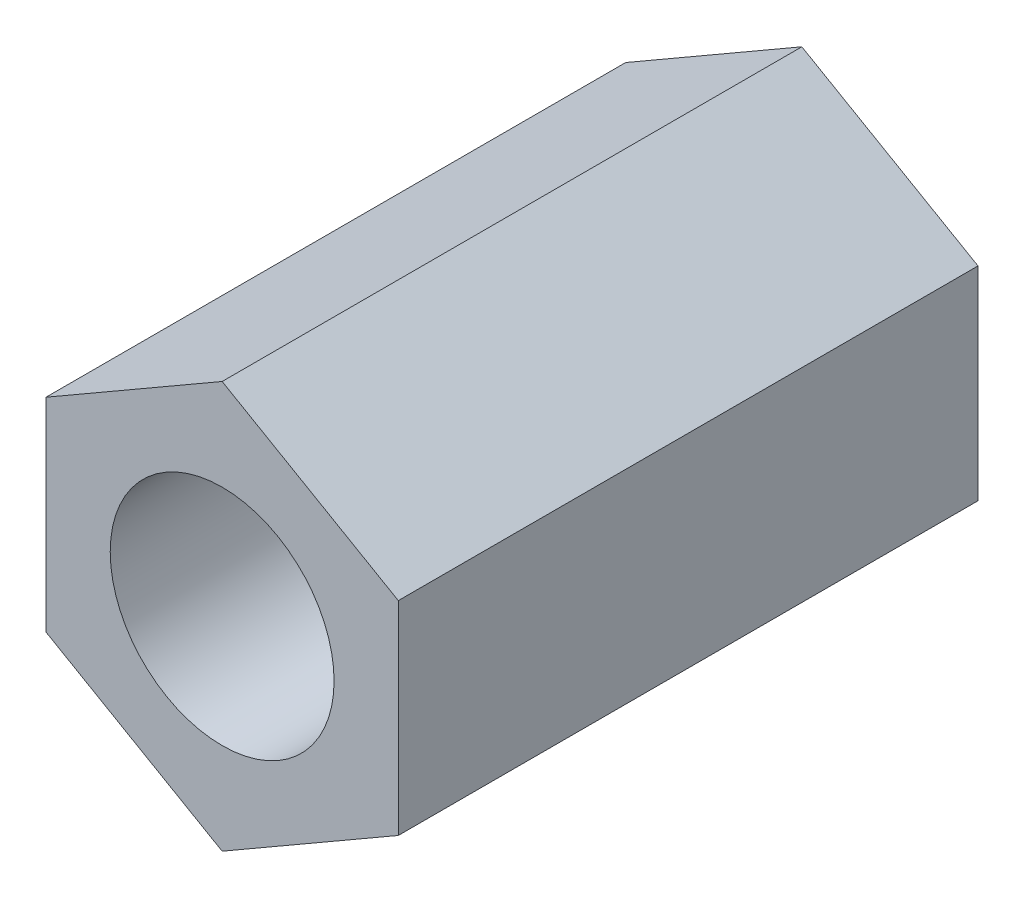
ISO-10303-21;
HEADER;
FILE_DESCRIPTION(('STEP AP214'),'2;1');
FILE_NAME('part.step','',(''),(''),'','','');
FILE_SCHEMA(('AUTOMOTIVE_DESIGN { 1 0 10303 214 1 1 1 1 }'));
ENDSEC;
DATA;
#1=APPLICATION_CONTEXT('core data for automotive mechanical design processes');
#2=APPLICATION_PROTOCOL_DEFINITION('international standard','automotive_design',2000,#1);
#3=PRODUCT_CONTEXT('',#1,'mechanical');
#4=PRODUCT('Part','Part','',(#3));
#5=PRODUCT_RELATED_PRODUCT_CATEGORY('part','',(#4));
#6=PRODUCT_DEFINITION_FORMATION('','',#4);
#7=PRODUCT_DEFINITION_CONTEXT('part definition',#1,'design');
#8=PRODUCT_DEFINITION('design','',#6,#7);
#9=PRODUCT_DEFINITION_SHAPE('','',#8);
#10=(LENGTH_UNIT() NAMED_UNIT(*) SI_UNIT(.MILLI.,.METRE.));
#11=(NAMED_UNIT(*) PLANE_ANGLE_UNIT() SI_UNIT($,.RADIAN.));
#12=(NAMED_UNIT(*) SI_UNIT($,.STERADIAN.) SOLID_ANGLE_UNIT());
#13=UNCERTAINTY_MEASURE_WITH_UNIT(LENGTH_MEASURE(1.E-05),#10,'distance_accuracy_value','');
#14=(GEOMETRIC_REPRESENTATION_CONTEXT(3) GLOBAL_UNCERTAINTY_ASSIGNED_CONTEXT((#13)) GLOBAL_UNIT_ASSIGNED_CONTEXT((#10,
#11,#12)) REPRESENTATION_CONTEXT('',''));
#15=CARTESIAN_POINT('',(0.,0.,0.));
#16=DIRECTION('',(0.,0.,1.));
#17=DIRECTION('',(1.,0.,0.));
#18=AXIS2_PLACEMENT_3D('',#15,#16,#17);
#19=CARTESIAN_POINT('',(2.75,1.58771324027147,10.));
#20=DIRECTION('',(-0.5,-0.866025403784439,0.));
#21=DIRECTION('',(0.866025403784439,-0.5,0.));
#22=AXIS2_PLACEMENT_3D('',#19,#20,#21);
#23=PLANE('',#22);
#24=DIRECTION('',(0.866025403784439,-0.5,0.));
#25=VECTOR('',#24,1.);
#26=CARTESIAN_POINT('',(2.75,1.58771324027147,0.95));
#27=LINE('',#26,#25);
#28=CARTESIAN_POINT('',(0.,3.17542648054295,0.95));
#29=VERTEX_POINT('',#28);
#30=CARTESIAN_POINT('',(2.75,1.58771324027147,0.95));
#31=VERTEX_POINT('',#30);
#32=EDGE_CURVE('E32',#29,#31,#27,.T.);
#33=ORIENTED_EDGE('',*,*,#32,.F.);
#34=DIRECTION('',(0.,0.,-1.));
#35=VECTOR('',#34,1.);
#36=CARTESIAN_POINT('',(0.,3.17542648054295,10.));
#37=LINE('',#36,#35);
#38=CARTESIAN_POINT('',(0.,3.17542648054295,10.));
#39=VERTEX_POINT('',#38);
#40=EDGE_CURVE('E11',#39,#29,#37,.T.);
#41=ORIENTED_EDGE('',*,*,#40,.F.);
#42=DIRECTION('',(-0.866025403784439,0.5,0.));
#43=VECTOR('',#42,1.);
#44=CARTESIAN_POINT('',(2.75,1.58771324027147,10.));
#45=LINE('',#44,#43);
#46=CARTESIAN_POINT('',(2.75,1.58771324027147,10.));
#47=VERTEX_POINT('',#46);
#48=EDGE_CURVE('E120',#47,#39,#45,.T.);
#49=ORIENTED_EDGE('',*,*,#48,.F.);
#50=DIRECTION('',(0.,0.,-1.));
#51=VECTOR('',#50,1.);
#52=CARTESIAN_POINT('',(2.75,1.58771324027147,10.));
#53=LINE('',#52,#51);
#54=EDGE_CURVE('E88',#47,#31,#53,.T.);
#55=ORIENTED_EDGE('',*,*,#54,.T.);
#56=EDGE_LOOP('',(#33,#41,#49,#55));
#57=FACE_BOUND('',#56,.T.);
#58=ADVANCED_FACE('F17',(#57),#23,.F.);
#59=CARTESIAN_POINT('',(0.,3.17542648054295,10.));
#60=DIRECTION('',(0.5,-0.866025403784439,0.));
#61=DIRECTION('',(0.866025403784439,0.5,0.));
#62=AXIS2_PLACEMENT_3D('',#59,#60,#61);
#63=PLANE('',#62);
#64=DIRECTION('',(0.866025403784439,0.5,0.));
#65=VECTOR('',#64,1.);
#66=CARTESIAN_POINT('',(0.,3.17542648054295,0.95));
#67=LINE('',#66,#65);
#68=CARTESIAN_POINT('',(-2.75,1.58771324027147,0.95));
#69=VERTEX_POINT('',#68);
#70=EDGE_CURVE('E110',#69,#29,#67,.T.);
#71=ORIENTED_EDGE('',*,*,#70,.F.);
#72=DIRECTION('',(0.,0.,-1.));
#73=VECTOR('',#72,1.);
#74=CARTESIAN_POINT('',(-2.75,1.58771324027147,10.));
#75=LINE('',#74,#73);
#76=CARTESIAN_POINT('',(-2.75,1.58771324027147,10.));
#77=VERTEX_POINT('',#76);
#78=EDGE_CURVE('E25',#77,#69,#75,.T.);
#79=ORIENTED_EDGE('',*,*,#78,.F.);
#80=DIRECTION('',(-0.866025403784439,-0.5,0.));
#81=VECTOR('',#80,1.);
#82=CARTESIAN_POINT('',(0.,3.17542648054295,10.));
#83=LINE('',#82,#81);
#84=EDGE_CURVE('E109',#39,#77,#83,.T.);
#85=ORIENTED_EDGE('',*,*,#84,.F.);
#86=ORIENTED_EDGE('',*,*,#40,.T.);
#87=EDGE_LOOP('',(#71,#79,#85,#86));
#88=FACE_BOUND('',#87,.T.);
#89=ADVANCED_FACE('F108',(#88),#63,.F.);
#90=CARTESIAN_POINT('',(-2.75,1.58771324027147,10.));
#91=DIRECTION('',(1.,0.,0.));
#92=DIRECTION('',(0.,1.,0.));
#93=AXIS2_PLACEMENT_3D('',#90,#91,#92);
#94=PLANE('',#93);
#95=DIRECTION('',(0.,1.,0.));
#96=VECTOR('',#95,1.);
#97=CARTESIAN_POINT('',(-2.75,1.58771324027147,0.95));
#98=LINE('',#97,#96);
#99=CARTESIAN_POINT('',(-2.75,-1.58771324027147,0.95));
#100=VERTEX_POINT('',#99);
#101=EDGE_CURVE('E104',#100,#69,#98,.T.);
#102=ORIENTED_EDGE('',*,*,#101,.F.);
#103=DIRECTION('',(0.,0.,-1.));
#104=VECTOR('',#103,1.);
#105=CARTESIAN_POINT('',(-2.75,-1.58771324027147,10.));
#106=LINE('',#105,#104);
#107=CARTESIAN_POINT('',(-2.75,-1.58771324027147,10.));
#108=VERTEX_POINT('',#107);
#109=EDGE_CURVE('E90',#108,#100,#106,.T.);
#110=ORIENTED_EDGE('',*,*,#109,.F.);
#111=DIRECTION('',(0.,-1.,0.));
#112=VECTOR('',#111,1.);
#113=CARTESIAN_POINT('',(-2.75,1.58771324027147,10.));
#114=LINE('',#113,#112);
#115=EDGE_CURVE('E105',#77,#108,#114,.T.);
#116=ORIENTED_EDGE('',*,*,#115,.F.);
#117=ORIENTED_EDGE('',*,*,#78,.T.);
#118=EDGE_LOOP('',(#102,#110,#116,#117));
#119=FACE_BOUND('',#118,.T.);
#120=ADVANCED_FACE('F102',(#119),#94,.F.);
#121=CARTESIAN_POINT('',(-2.75,-1.58771324027147,10.));
#122=DIRECTION('',(0.5,0.866025403784439,0.));
#123=DIRECTION('',(-0.866025403784439,0.5,0.));
#124=AXIS2_PLACEMENT_3D('',#121,#122,#123);
#125=PLANE('',#124);
#126=DIRECTION('',(-0.866025403784439,0.5,0.));
#127=VECTOR('',#126,1.);
#128=CARTESIAN_POINT('',(-2.75,-1.58771324027147,0.95));
#129=LINE('',#128,#127);
#130=CARTESIAN_POINT('',(0.,-3.17542648054294,0.95));
#131=VERTEX_POINT('',#130);
#132=EDGE_CURVE('E85',#131,#100,#129,.T.);
#133=ORIENTED_EDGE('',*,*,#132,.F.);
#134=DIRECTION('',(0.,0.,-1.));
#135=VECTOR('',#134,1.);
#136=CARTESIAN_POINT('',(0.,-3.17542648054294,10.));
#137=LINE('',#136,#135);
#138=CARTESIAN_POINT('',(0.,-3.17542648054294,10.));
#139=VERTEX_POINT('',#138);
#140=EDGE_CURVE('E84',#139,#131,#137,.T.);
#141=ORIENTED_EDGE('',*,*,#140,.F.);
#142=DIRECTION('',(0.866025403784439,-0.5,0.));
#143=VECTOR('',#142,1.);
#144=CARTESIAN_POINT('',(-2.75,-1.58771324027147,10.));
#145=LINE('',#144,#143);
#146=EDGE_CURVE('E124',#108,#139,#145,.T.);
#147=ORIENTED_EDGE('',*,*,#146,.F.);
#148=ORIENTED_EDGE('',*,*,#109,.T.);
#149=EDGE_LOOP('',(#133,#141,#147,#148));
#150=FACE_BOUND('',#149,.T.);
#151=ADVANCED_FACE('F131',(#150),#125,.F.);
#152=CARTESIAN_POINT('',(0.,-3.17542648054294,10.));
#153=DIRECTION('',(-0.5,0.866025403784439,0.));
#154=DIRECTION('',(-0.866025403784439,-0.5,0.));
#155=AXIS2_PLACEMENT_3D('',#152,#153,#154);
#156=PLANE('',#155);
#157=DIRECTION('',(-0.866025403784439,-0.5,0.));
#158=VECTOR('',#157,1.);
#159=CARTESIAN_POINT('',(0.,-3.17542648054294,0.95));
#160=LINE('',#159,#158);
#161=CARTESIAN_POINT('',(2.75,-1.58771324027147,0.95));
#162=VERTEX_POINT('',#161);
#163=EDGE_CURVE('E71',#162,#131,#160,.T.);
#164=ORIENTED_EDGE('',*,*,#163,.F.);
#165=DIRECTION('',(0.,0.,-1.));
#166=VECTOR('',#165,1.);
#167=CARTESIAN_POINT('',(2.75,-1.58771324027147,10.));
#168=LINE('',#167,#166);
#169=CARTESIAN_POINT('',(2.75,-1.58771324027147,10.));
#170=VERTEX_POINT('',#169);
#171=EDGE_CURVE('E82',#170,#162,#168,.T.);
#172=ORIENTED_EDGE('',*,*,#171,.F.);
#173=DIRECTION('',(0.866025403784439,0.5,0.));
#174=VECTOR('',#173,1.);
#175=CARTESIAN_POINT('',(0.,-3.17542648054294,10.));
#176=LINE('',#175,#174);
#177=EDGE_CURVE('E126',#139,#170,#176,.T.);
#178=ORIENTED_EDGE('',*,*,#177,.F.);
#179=ORIENTED_EDGE('',*,*,#140,.T.);
#180=EDGE_LOOP('',(#164,#172,#178,#179));
#181=FACE_BOUND('',#180,.T.);
#182=ADVANCED_FACE('F80',(#181),#156,.F.);
#183=CARTESIAN_POINT('',(2.75,-1.58771324027147,10.));
#184=DIRECTION('',(-1.,0.,0.));
#185=DIRECTION('',(0.,-1.,0.));
#186=AXIS2_PLACEMENT_3D('',#183,#184,#185);
#187=PLANE('',#186);
#188=DIRECTION('',(0.,-1.,0.));
#189=VECTOR('',#188,1.);
#190=CARTESIAN_POINT('',(2.75,-1.58771324027147,0.95));
#191=LINE('',#190,#189);
#192=EDGE_CURVE('E68',#31,#162,#191,.T.);
#193=ORIENTED_EDGE('',*,*,#192,.F.);
#194=ORIENTED_EDGE('',*,*,#54,.F.);
#195=DIRECTION('',(0.,1.,0.));
#196=VECTOR('',#195,1.);
#197=CARTESIAN_POINT('',(2.75,-1.58771324027147,10.));
#198=LINE('',#197,#196);
#199=EDGE_CURVE('E40',#170,#47,#198,.T.);
#200=ORIENTED_EDGE('',*,*,#199,.F.);
#201=ORIENTED_EDGE('',*,*,#171,.T.);
#202=EDGE_LOOP('',(#193,#194,#200,#201));
#203=FACE_BOUND('',#202,.T.);
#204=ADVANCED_FACE('F87',(#203),#187,.F.);
#205=CARTESIAN_POINT('',(0.,0.,10.));
#206=DIRECTION('',(0.,0.,-1.));
#207=DIRECTION('',(-1.,0.,0.));
#208=AXIS2_PLACEMENT_3D('',#205,#206,#207);
#209=CYLINDRICAL_SURFACE('',#208,1.74741507467277);
#210=CARTESIAN_POINT('',(0.,0.,10.));
#211=DIRECTION('',(0.,0.,1.));
#212=DIRECTION('',(1.,0.,0.));
#213=AXIS2_PLACEMENT_3D('',#210,#211,#212);
#214=CIRCLE('',#213,1.74741507467277);
#215=CARTESIAN_POINT('',(1.74741507467277,0.,10.));
#216=VERTEX_POINT('',#215);
#217=EDGE_CURVE('E113',#216,#216,#214,.T.);
#218=ORIENTED_EDGE('',*,*,#217,.T.);
#219=EDGE_LOOP('',(#218));
#220=FACE_BOUND('',#219,.T.);
#221=CARTESIAN_POINT('',(0.,0.,0.95));
#222=DIRECTION('',(0.,0.,-1.));
#223=DIRECTION('',(-1.,0.,0.));
#224=AXIS2_PLACEMENT_3D('',#221,#222,#223);
#225=CIRCLE('',#224,1.74741507467277);
#226=CARTESIAN_POINT('',(-1.74741507467277,0.,0.95));
#227=VERTEX_POINT('',#226);
#228=EDGE_CURVE('E20',#227,#227,#225,.T.);
#229=ORIENTED_EDGE('',*,*,#228,.T.);
#230=EDGE_LOOP('',(#229));
#231=FACE_BOUND('',#230,.T.);
#232=ADVANCED_FACE('F179',(#220,#231),#209,.F.);
#233=CARTESIAN_POINT('',(0.,3.17542648054295,10.));
#234=DIRECTION('',(0.,0.,1.));
#235=DIRECTION('',(1.,0.,0.));
#236=AXIS2_PLACEMENT_3D('',#233,#234,#235);
#237=PLANE('',#236);
#238=ORIENTED_EDGE('',*,*,#48,.T.);
#239=ORIENTED_EDGE('',*,*,#84,.T.);
#240=ORIENTED_EDGE('',*,*,#115,.T.);
#241=ORIENTED_EDGE('',*,*,#146,.T.);
#242=ORIENTED_EDGE('',*,*,#177,.T.);
#243=ORIENTED_EDGE('',*,*,#199,.T.);
#244=EDGE_LOOP('',(#238,#239,#240,#241,#242,#243));
#245=FACE_BOUND('',#244,.T.);
#246=ORIENTED_EDGE('',*,*,#217,.F.);
#247=EDGE_LOOP('',(#246));
#248=FACE_BOUND('',#247,.T.);
#249=ADVANCED_FACE('F127',(#245,#248),#237,.T.);
#250=CARTESIAN_POINT('',(0.,0.,0.95));
#251=DIRECTION('',(0.,0.,-1.));
#252=DIRECTION('',(-1.,0.,0.));
#253=AXIS2_PLACEMENT_3D('',#250,#251,#252);
#254=PLANE('',#253);
#255=ORIENTED_EDGE('',*,*,#228,.F.);
#256=EDGE_LOOP('',(#255));
#257=FACE_BOUND('',#256,.T.);
#258=ORIENTED_EDGE('',*,*,#32,.T.);
#259=ORIENTED_EDGE('',*,*,#192,.T.);
#260=ORIENTED_EDGE('',*,*,#163,.T.);
#261=ORIENTED_EDGE('',*,*,#132,.T.);
#262=ORIENTED_EDGE('',*,*,#101,.T.);
#263=ORIENTED_EDGE('',*,*,#70,.T.);
#264=EDGE_LOOP('',(#258,#259,#260,#261,#262,#263));
#265=FACE_BOUND('',#264,.T.);
#266=ADVANCED_FACE('F70',(#257,#265),#254,.T.);
#267=CLOSED_SHELL('',(#58,#89,#120,#151,#182,#204,#232,#249,#266));
#268=MANIFOLD_SOLID_BREP('B1',#267);
#269=ADVANCED_BREP_SHAPE_REPRESENTATION('',(#18,#268),#14);
#270=SHAPE_DEFINITION_REPRESENTATION(#9,#269);
ENDSEC;
END-ISO-10303-21;
